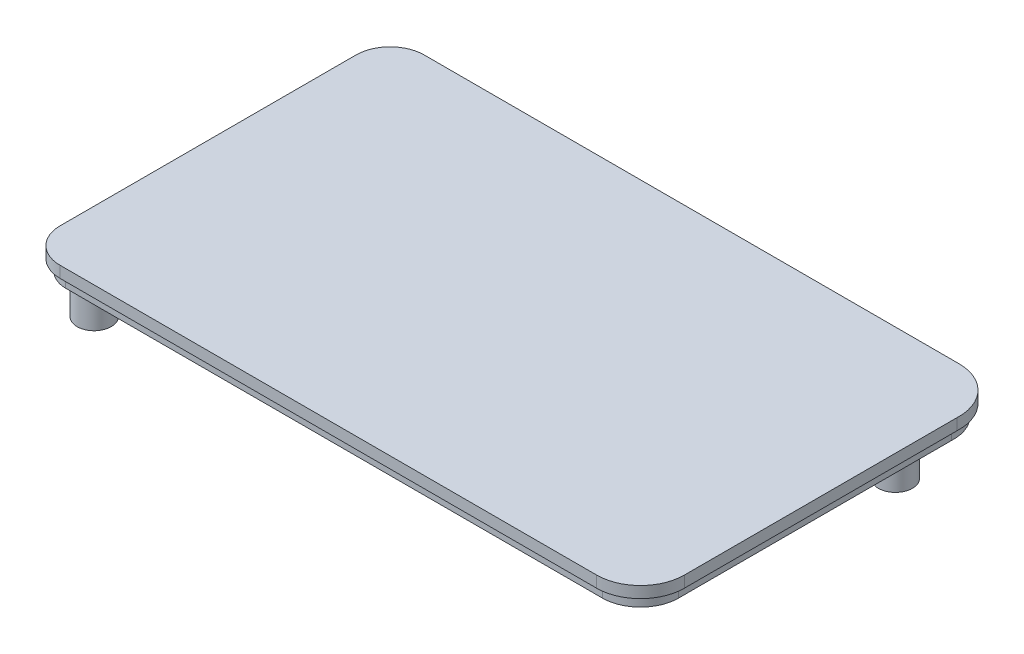
ISO-10303-21;
HEADER;
FILE_DESCRIPTION(('STEP AP214'),'2;1');
FILE_NAME('part.step','',(''),(''),'','','');
FILE_SCHEMA(('AUTOMOTIVE_DESIGN { 1 0 10303 214 1 1 1 1 }'));
ENDSEC;
DATA;
#1=APPLICATION_CONTEXT('core data for automotive mechanical design processes');
#2=APPLICATION_PROTOCOL_DEFINITION('international standard','automotive_design',2000,#1);
#3=PRODUCT_CONTEXT('',#1,'mechanical');
#4=PRODUCT('Part','Part','',(#3));
#5=PRODUCT_RELATED_PRODUCT_CATEGORY('part','',(#4));
#6=PRODUCT_DEFINITION_FORMATION('','',#4);
#7=PRODUCT_DEFINITION_CONTEXT('part definition',#1,'design');
#8=PRODUCT_DEFINITION('design','',#6,#7);
#9=PRODUCT_DEFINITION_SHAPE('','',#8);
#10=(LENGTH_UNIT() NAMED_UNIT(*) SI_UNIT(.MILLI.,.METRE.));
#11=(NAMED_UNIT(*) PLANE_ANGLE_UNIT() SI_UNIT($,.RADIAN.));
#12=(NAMED_UNIT(*) SI_UNIT($,.STERADIAN.) SOLID_ANGLE_UNIT());
#13=UNCERTAINTY_MEASURE_WITH_UNIT(LENGTH_MEASURE(1.E-05),#10,'distance_accuracy_value','');
#14=(GEOMETRIC_REPRESENTATION_CONTEXT(3) GLOBAL_UNCERTAINTY_ASSIGNED_CONTEXT((#13)) GLOBAL_UNIT_ASSIGNED_CONTEXT((#10,
#11,#12)) REPRESENTATION_CONTEXT('',''));
#15=CARTESIAN_POINT('',(0.,0.,0.));
#16=DIRECTION('',(0.,0.,1.));
#17=DIRECTION('',(1.,0.,0.));
#18=AXIS2_PLACEMENT_3D('',#15,#16,#17);
#19=CARTESIAN_POINT('',(73.2039928257921,2.,-27.8016177597412));
#20=DIRECTION('',(-0.999999998804765,0.,4.88924354639537E-05));
#21=DIRECTION('',(4.88924354639537E-05,0.,0.999999998804765));
#22=AXIS2_PLACEMENT_3D('',#19,#20,#21);
#23=PLANE('',#22);
#24=CARTESIAN_POINT('',(69.3542968956756,1.,-3.85086717604934));
#25=DIRECTION('',(0.,-1.,0.));
#26=DIRECTION('',(0.,0.,-1.));
#27=AXIS2_PLACEMENT_3D('',#24,#25,#26);
#28=CIRCLE('',#27,3.85086716973928);
#29=CARTESIAN_POINT('',(73.2051639113889,1.,-3.84977801728181));
#30=VERTEX_POINT('',#29);
#31=CARTESIAN_POINT('',(73.2051638872787,1.,-3.84969587016244));
#32=VERTEX_POINT('',#31);
#33=EDGE_CURVE('E236',#30,#32,#28,.T.);
#34=ORIENTED_EDGE('',*,*,#33,.F.);
#35=DIRECTION('',(-4.88924354639537E-05,0.,-0.999999998804765));
#36=VECTOR('',#35,1.);
#37=CARTESIAN_POINT('',(73.2039928257921,1.,-27.8016177597412));
#38=LINE('',#37,#36);
#39=CARTESIAN_POINT('',(73.2039928257921,1.,-27.8016177597412));
#40=VERTEX_POINT('',#39);
#41=EDGE_CURVE('E242',#30,#40,#38,.T.);
#42=ORIENTED_EDGE('',*,*,#41,.T.);
#43=DIRECTION('',(0.,-1.,0.));
#44=VECTOR('',#43,1.);
#45=CARTESIAN_POINT('',(73.2039928257921,2.,-27.8016177597412));
#46=LINE('',#45,#44);
#47=CARTESIAN_POINT('',(73.2039928257921,2.,-27.8016177597412));
#48=VERTEX_POINT('',#47);
#49=EDGE_CURVE('E268',#48,#40,#46,.T.);
#50=ORIENTED_EDGE('',*,*,#49,.F.);
#51=DIRECTION('',(-4.88924354639537E-05,0.,-0.999999998804765));
#52=VECTOR('',#51,1.);
#53=CARTESIAN_POINT('',(73.2039928257921,2.,-27.8016177597412));
#54=LINE('',#53,#52);
#55=CARTESIAN_POINT('',(73.2051638935887,2.,-3.84969587016052));
#56=VERTEX_POINT('',#55);
#57=EDGE_CURVE('E256',#56,#48,#54,.T.);
#58=ORIENTED_EDGE('',*,*,#57,.F.);
#59=DIRECTION('',(0.,-1.,0.));
#60=VECTOR('',#59,1.);
#61=CARTESIAN_POINT('',(73.2051638935887,2.,-3.84969587016052));
#62=LINE('',#61,#60);
#63=EDGE_CURVE('E271',#56,#32,#62,.T.);
#64=ORIENTED_EDGE('',*,*,#63,.T.);
#65=EDGE_LOOP('',(#34,#42,#50,#58,#64));
#66=FACE_BOUND('',#65,.T.);
#67=ADVANCED_FACE('F35',(#66),#23,.F.);
#68=CARTESIAN_POINT('',(22.2058950541222,2.,-28.9992690193114));
#69=DIRECTION('',(0.,-1.,0.));
#70=DIRECTION('',(0.,0.,-1.));
#71=AXIS2_PLACEMENT_3D('',#68,#69,#70);
#72=CYLINDRICAL_SURFACE('',#71,3.00073111427178);
#73=DIRECTION('',(0.,-1.,0.));
#74=VECTOR('',#73,1.);
#75=CARTESIAN_POINT('',(22.2058950541222,2.,-32.0000001335832));
#76=LINE('',#75,#74);
#77=CARTESIAN_POINT('',(22.2058950541222,2.,-32.0000001335832));
#78=VERTEX_POINT('',#77);
#79=CARTESIAN_POINT('',(22.2058950541222,1.,-32.0000001335832));
#80=VERTEX_POINT('',#79);
#81=EDGE_CURVE('E262',#78,#80,#76,.T.);
#82=ORIENTED_EDGE('',*,*,#81,.T.);
#83=CARTESIAN_POINT('',(22.2058950541222,1.,-28.9992690193114));
#84=DIRECTION('',(0.,-1.,0.));
#85=DIRECTION('',(0.,0.,-1.));
#86=AXIS2_PLACEMENT_3D('',#83,#84,#85);
#87=CIRCLE('',#86,3.00073111427178);
#88=CARTESIAN_POINT('',(19.2051639398505,1.,-28.9992690193114));
#89=VERTEX_POINT('',#88);
#90=EDGE_CURVE('E50',#89,#80,#87,.T.);
#91=ORIENTED_EDGE('',*,*,#90,.F.);
#92=DIRECTION('',(0.,-1.,0.));
#93=VECTOR('',#92,1.);
#94=CARTESIAN_POINT('',(19.2051639398505,2.,-28.9992690193114));
#95=LINE('',#94,#93);
#96=CARTESIAN_POINT('',(19.2051639398505,2.,-28.9992690193114));
#97=VERTEX_POINT('',#96);
#98=EDGE_CURVE('E283',#97,#89,#95,.T.);
#99=ORIENTED_EDGE('',*,*,#98,.F.);
#100=CARTESIAN_POINT('',(22.2058950541222,2.,-28.9992690193114));
#101=DIRECTION('',(0.,1.,0.));
#102=DIRECTION('',(0.,0.,-1.));
#103=AXIS2_PLACEMENT_3D('',#100,#101,#102);
#104=CIRCLE('',#103,3.00073111427178);
#105=EDGE_CURVE('E245',#78,#97,#104,.T.);
#106=ORIENTED_EDGE('',*,*,#105,.F.);
#107=EDGE_LOOP('',(#82,#91,#99,#106));
#108=FACE_BOUND('',#107,.T.);
#109=ADVANCED_FACE('F37',(#108),#72,.T.);
#110=CARTESIAN_POINT('',(19.2051639398505,2.,-3.0007304011226));
#111=DIRECTION('',(1.,0.,0.));
#112=DIRECTION('',(0.,0.,-1.));
#113=AXIS2_PLACEMENT_3D('',#110,#111,#112);
#114=PLANE('',#113);
#115=ORIENTED_EDGE('',*,*,#98,.T.);
#116=DIRECTION('',(0.,0.,-1.));
#117=VECTOR('',#116,1.);
#118=CARTESIAN_POINT('',(19.2051639398505,1.,-28.9992690193114));
#119=LINE('',#118,#117);
#120=CARTESIAN_POINT('',(19.2051639398505,1.,-3.0007304011226));
#121=VERTEX_POINT('',#120);
#122=EDGE_CURVE('E230',#121,#89,#119,.T.);
#123=ORIENTED_EDGE('',*,*,#122,.F.);
#124=DIRECTION('',(0.,-1.,0.));
#125=VECTOR('',#124,1.);
#126=CARTESIAN_POINT('',(19.2051639398505,2.,-3.0007304011226));
#127=LINE('',#126,#125);
#128=CARTESIAN_POINT('',(19.2051639398505,2.,-3.0007304011226));
#129=VERTEX_POINT('',#128);
#130=EDGE_CURVE('E280',#129,#121,#127,.T.);
#131=ORIENTED_EDGE('',*,*,#130,.F.);
#132=DIRECTION('',(0.,0.,1.));
#133=VECTOR('',#132,1.);
#134=CARTESIAN_POINT('',(19.2051639398505,2.,-3.0007304011226));
#135=LINE('',#134,#133);
#136=EDGE_CURVE('E248',#97,#129,#135,.T.);
#137=ORIENTED_EDGE('',*,*,#136,.F.);
#138=EDGE_LOOP('',(#115,#123,#131,#137));
#139=FACE_BOUND('',#138,.T.);
#140=ADVANCED_FACE('F322',(#139),#114,.F.);
#141=CARTESIAN_POINT('',(22.2058943409731,2.,-3.00073040112259));
#142=DIRECTION('',(0.,-1.,0.));
#143=DIRECTION('',(0.,0.,-1.));
#144=AXIS2_PLACEMENT_3D('',#141,#142,#143);
#145=CYLINDRICAL_SURFACE('',#144,3.00073040112259);
#146=ORIENTED_EDGE('',*,*,#130,.T.);
#147=CARTESIAN_POINT('',(22.2058943409731,1.,-3.0007304011226));
#148=DIRECTION('',(0.,-1.,0.));
#149=DIRECTION('',(0.,0.,1.));
#150=AXIS2_PLACEMENT_3D('',#147,#148,#149);
#151=CIRCLE('',#150,3.0007304011226);
#152=CARTESIAN_POINT('',(22.2058943409731,1.,0.));
#153=VERTEX_POINT('',#152);
#154=EDGE_CURVE('E217',#153,#121,#151,.T.);
#155=ORIENTED_EDGE('',*,*,#154,.F.);
#156=DIRECTION('',(0.,-1.,0.));
#157=VECTOR('',#156,1.);
#158=CARTESIAN_POINT('',(22.2058943409731,2.,0.));
#159=LINE('',#158,#157);
#160=CARTESIAN_POINT('',(22.2058943409731,2.,0.));
#161=VERTEX_POINT('',#160);
#162=EDGE_CURVE('E277',#161,#153,#159,.T.);
#163=ORIENTED_EDGE('',*,*,#162,.F.);
#164=CARTESIAN_POINT('',(22.2058943409731,2.,-3.00073040112259));
#165=DIRECTION('',(0.,1.,0.));
#166=DIRECTION('',(0.,0.,1.));
#167=AXIS2_PLACEMENT_3D('',#164,#165,#166);
#168=CIRCLE('',#167,3.00073040112259);
#169=EDGE_CURVE('E250',#129,#161,#168,.T.);
#170=ORIENTED_EDGE('',*,*,#169,.F.);
#171=EDGE_LOOP('',(#146,#155,#163,#170));
#172=FACE_BOUND('',#171,.T.);
#173=ADVANCED_FACE('F335',(#172),#145,.T.);
#174=CARTESIAN_POINT('',(69.3542968956755,2.,0.));
#175=DIRECTION('',(0.,0.,-1.));
#176=DIRECTION('',(-1.,0.,0.));
#177=AXIS2_PLACEMENT_3D('',#174,#175,#176);
#178=PLANE('',#177);
#179=ORIENTED_EDGE('',*,*,#162,.T.);
#180=DIRECTION('',(-1.,0.,0.));
#181=VECTOR('',#180,1.);
#182=CARTESIAN_POINT('',(22.2058943409731,1.,0.));
#183=LINE('',#182,#181);
#184=CARTESIAN_POINT('',(69.3542968956755,1.,0.));
#185=VERTEX_POINT('',#184);
#186=EDGE_CURVE('E238',#185,#153,#183,.T.);
#187=ORIENTED_EDGE('',*,*,#186,.F.);
#188=DIRECTION('',(0.,-1.,0.));
#189=VECTOR('',#188,1.);
#190=CARTESIAN_POINT('',(69.3542968956755,2.,0.));
#191=LINE('',#190,#189);
#192=CARTESIAN_POINT('',(69.3542968956755,2.,0.));
#193=VERTEX_POINT('',#192);
#194=EDGE_CURVE('E274',#193,#185,#191,.T.);
#195=ORIENTED_EDGE('',*,*,#194,.F.);
#196=DIRECTION('',(1.,0.,0.));
#197=VECTOR('',#196,1.);
#198=CARTESIAN_POINT('',(69.3542968956755,2.,0.));
#199=LINE('',#198,#197);
#200=EDGE_CURVE('E252',#161,#193,#199,.T.);
#201=ORIENTED_EDGE('',*,*,#200,.F.);
#202=EDGE_LOOP('',(#179,#187,#195,#201));
#203=FACE_BOUND('',#202,.T.);
#204=ADVANCED_FACE('F331',(#203),#178,.F.);
#205=CARTESIAN_POINT('',(69.3542968956755,2.,-3.85086717604935));
#206=DIRECTION('',(0.,-1.,0.));
#207=DIRECTION('',(0.,0.,-1.));
#208=AXIS2_PLACEMENT_3D('',#205,#206,#207);
#209=CYLINDRICAL_SURFACE('',#208,3.85086717604935);
#210=ORIENTED_EDGE('',*,*,#194,.T.);
#211=EDGE_CURVE('E235',#32,#185,#28,.T.);
#212=ORIENTED_EDGE('',*,*,#211,.F.);
#213=ORIENTED_EDGE('',*,*,#63,.F.);
#214=CARTESIAN_POINT('',(69.3542968956755,2.,-3.85086717604935));
#215=DIRECTION('',(0.,1.,0.));
#216=DIRECTION('',(0.,0.,1.));
#217=AXIS2_PLACEMENT_3D('',#214,#215,#216);
#218=CIRCLE('',#217,3.85086717604935);
#219=EDGE_CURVE('E254',#193,#56,#218,.T.);
#220=ORIENTED_EDGE('',*,*,#219,.F.);
#221=EDGE_LOOP('',(#210,#212,#213,#220));
#222=FACE_BOUND('',#221,.T.);
#223=ADVANCED_FACE('F328',(#222),#209,.T.);
#224=CARTESIAN_POINT('',(69.2040540247361,2.,-27.9953713049653));
#225=DIRECTION('',(0.,-1.,0.));
#226=DIRECTION('',(0.,0.,-1.));
#227=AXIS2_PLACEMENT_3D('',#224,#225,#226);
#228=CYLINDRICAL_SURFACE('',#227,4.00462867797753);
#229=ORIENTED_EDGE('',*,*,#49,.T.);
#230=CARTESIAN_POINT('',(69.2040540247361,1.,-27.9953713049653));
#231=DIRECTION('',(0.,1.,0.));
#232=DIRECTION('',(0.,0.,1.));
#233=AXIS2_PLACEMENT_3D('',#230,#231,#232);
#234=CIRCLE('',#233,4.00462867797753);
#235=CARTESIAN_POINT('',(69.2040540247361,1.,-31.9999999829428));
#236=VERTEX_POINT('',#235);
#237=EDGE_CURVE('E240',#40,#236,#234,.T.);
#238=ORIENTED_EDGE('',*,*,#237,.T.);
#239=DIRECTION('',(0.,-1.,0.));
#240=VECTOR('',#239,1.);
#241=CARTESIAN_POINT('',(69.2040540247361,2.,-31.9999999829428));
#242=LINE('',#241,#240);
#243=CARTESIAN_POINT('',(69.2040540247361,2.,-31.9999999829428));
#244=VERTEX_POINT('',#243);
#245=EDGE_CURVE('E265',#244,#236,#242,.T.);
#246=ORIENTED_EDGE('',*,*,#245,.F.);
#247=CARTESIAN_POINT('',(69.2040540247361,2.,-27.9953713049653));
#248=DIRECTION('',(0.,1.,0.));
#249=DIRECTION('',(0.,0.,1.));
#250=AXIS2_PLACEMENT_3D('',#247,#248,#249);
#251=CIRCLE('',#250,4.00462867797753);
#252=EDGE_CURVE('E258',#48,#244,#251,.T.);
#253=ORIENTED_EDGE('',*,*,#252,.F.);
#254=EDGE_LOOP('',(#229,#238,#246,#253));
#255=FACE_BOUND('',#254,.T.);
#256=ADVANCED_FACE('F327',(#255),#228,.T.);
#257=CARTESIAN_POINT('',(22.2058950541222,2.,-32.0000001335832));
#258=DIRECTION('',(-3.20524050790238E-09,0.,1.));
#259=DIRECTION('',(1.,0.,3.20524050790238E-09));
#260=AXIS2_PLACEMENT_3D('',#257,#258,#259);
#261=PLANE('',#260);
#262=ORIENTED_EDGE('',*,*,#245,.T.);
#263=DIRECTION('',(1.,0.,3.20524050790238E-09));
#264=VECTOR('',#263,1.);
#265=CARTESIAN_POINT('',(69.2040540247361,1.,-31.9999999829428));
#266=LINE('',#265,#264);
#267=EDGE_CURVE('E233',#80,#236,#266,.T.);
#268=ORIENTED_EDGE('',*,*,#267,.F.);
#269=ORIENTED_EDGE('',*,*,#81,.F.);
#270=DIRECTION('',(-1.,0.,-3.20524050790238E-09));
#271=VECTOR('',#270,1.);
#272=CARTESIAN_POINT('',(22.2058950541222,2.,-32.0000001335832));
#273=LINE('',#272,#271);
#274=EDGE_CURVE('E260',#244,#78,#273,.T.);
#275=ORIENTED_EDGE('',*,*,#274,.F.);
#276=EDGE_LOOP('',(#262,#268,#269,#275));
#277=FACE_BOUND('',#276,.T.);
#278=ADVANCED_FACE('F350',(#277),#261,.F.);
#279=CARTESIAN_POINT('',(22.2058950541222,2.,-28.9992690193114));
#280=DIRECTION('',(0.,-1.,0.));
#281=DIRECTION('',(0.,0.,-1.));
#282=AXIS2_PLACEMENT_3D('',#279,#280,#281);
#283=PLANE('',#282);
#284=ORIENTED_EDGE('',*,*,#105,.T.);
#285=ORIENTED_EDGE('',*,*,#136,.T.);
#286=ORIENTED_EDGE('',*,*,#169,.T.);
#287=ORIENTED_EDGE('',*,*,#200,.T.);
#288=ORIENTED_EDGE('',*,*,#219,.T.);
#289=ORIENTED_EDGE('',*,*,#57,.T.);
#290=ORIENTED_EDGE('',*,*,#252,.T.);
#291=ORIENTED_EDGE('',*,*,#274,.T.);
#292=EDGE_LOOP('',(#284,#285,#286,#287,#288,#289,#290,#291));
#293=FACE_BOUND('',#292,.T.);
#294=ADVANCED_FACE('F357',(#293),#283,.F.);
#295=CARTESIAN_POINT('',(22.2058943409731,1.,-3.0007304011226));
#296=DIRECTION('',(0.,1.,0.));
#297=DIRECTION('',(0.,0.,1.));
#298=AXIS2_PLACEMENT_3D('',#295,#296,#297);
#299=PLANE('',#298);
#300=CARTESIAN_POINT('',(22.2058943409731,1.,-3.0007304011226));
#301=DIRECTION('',(0.,-1.,0.));
#302=DIRECTION('',(0.,0.,1.));
#303=AXIS2_PLACEMENT_3D('',#300,#301,#302);
#304=CIRCLE('',#303,2.5007304011226);
#305=CARTESIAN_POINT('',(22.2058943409731,1.,-0.5));
#306=VERTEX_POINT('',#305);
#307=CARTESIAN_POINT('',(19.7051639398505,1.,-3.0007304011226));
#308=VERTEX_POINT('',#307);
#309=EDGE_CURVE('E170',#306,#308,#304,.T.);
#310=ORIENTED_EDGE('',*,*,#309,.F.);
#311=DIRECTION('',(-1.,0.,0.));
#312=VECTOR('',#311,1.);
#313=CARTESIAN_POINT('',(22.2058943409731,1.,-0.5));
#314=LINE('',#313,#312);
#315=CARTESIAN_POINT('',(69.3542968956755,1.,-0.500000000000004));
#316=VERTEX_POINT('',#315);
#317=EDGE_CURVE('E164',#316,#306,#314,.T.);
#318=ORIENTED_EDGE('',*,*,#317,.F.);
#319=CARTESIAN_POINT('',(69.3542968956756,1.,-3.85086717604934));
#320=DIRECTION('',(0.,-1.,0.));
#321=DIRECTION('',(0.,0.,-1.));
#322=AXIS2_PLACEMENT_3D('',#319,#320,#321);
#323=CIRCLE('',#322,3.35086717604933);
#324=CARTESIAN_POINT('',(72.7051639167181,1.,-3.84984795355308));
#325=VERTEX_POINT('',#324);
#326=EDGE_CURVE('E197',#325,#316,#323,.T.);
#327=ORIENTED_EDGE('',*,*,#326,.F.);
#328=DIRECTION('',(2.4421707192363E-05,0.,0.99999999970179));
#329=VECTOR('',#328,1.);
#330=CARTESIAN_POINT('',(72.7051639167181,1.,-3.84984795355308));
#331=LINE('',#330,#329);
#332=CARTESIAN_POINT('',(72.7045783828186,1.,-27.8258089595757));
#333=VERTEX_POINT('',#332);
#334=EDGE_CURVE('E194',#333,#325,#331,.T.);
#335=ORIENTED_EDGE('',*,*,#334,.F.);
#336=CARTESIAN_POINT('',(69.2040540247361,1.,-27.9953713049652));
#337=DIRECTION('',(0.,-1.,0.));
#338=DIRECTION('',(0.,0.,-1.));
#339=AXIS2_PLACEMENT_3D('',#336,#337,#338);
#340=CIRCLE('',#339,3.50462867797756);
#341=CARTESIAN_POINT('',(69.2040540247361,1.,-31.4999999829428));
#342=VERTEX_POINT('',#341);
#343=EDGE_CURVE('E191',#342,#333,#340,.T.);
#344=ORIENTED_EDGE('',*,*,#343,.F.);
#345=DIRECTION('',(1.,0.,3.20524050790238E-09));
#346=VECTOR('',#345,1.);
#347=CARTESIAN_POINT('',(69.2040540247361,1.,-31.4999999829428));
#348=LINE('',#347,#346);
#349=CARTESIAN_POINT('',(22.2058950541222,1.,-31.5000001335832));
#350=VERTEX_POINT('',#349);
#351=EDGE_CURVE('E188',#350,#342,#348,.T.);
#352=ORIENTED_EDGE('',*,*,#351,.F.);
#353=CARTESIAN_POINT('',(22.2058950541222,1.,-28.9992690193114));
#354=DIRECTION('',(0.,-1.,0.));
#355=DIRECTION('',(0.,0.,-1.));
#356=AXIS2_PLACEMENT_3D('',#353,#354,#355);
#357=CIRCLE('',#356,2.50073111427178);
#358=CARTESIAN_POINT('',(19.7051639398505,1.,-28.9992690193114));
#359=VERTEX_POINT('',#358);
#360=EDGE_CURVE('E174',#359,#350,#357,.T.);
#361=ORIENTED_EDGE('',*,*,#360,.F.);
#362=DIRECTION('',(0.,0.,-1.));
#363=VECTOR('',#362,1.);
#364=CARTESIAN_POINT('',(19.7051639398505,1.,-28.9992690193114));
#365=LINE('',#364,#363);
#366=EDGE_CURVE('E156',#308,#359,#365,.T.);
#367=ORIENTED_EDGE('',*,*,#366,.F.);
#368=EDGE_LOOP('',(#310,#318,#327,#335,#344,#352,#361,#367));
#369=FACE_BOUND('',#368,.T.);
#370=ORIENTED_EDGE('',*,*,#33,.T.);
#371=ORIENTED_EDGE('',*,*,#211,.T.);
#372=ORIENTED_EDGE('',*,*,#186,.T.);
#373=ORIENTED_EDGE('',*,*,#154,.T.);
#374=ORIENTED_EDGE('',*,*,#122,.T.);
#375=ORIENTED_EDGE('',*,*,#90,.T.);
#376=ORIENTED_EDGE('',*,*,#267,.T.);
#377=ORIENTED_EDGE('',*,*,#237,.F.);
#378=ORIENTED_EDGE('',*,*,#41,.F.);
#379=EDGE_LOOP('',(#370,#371,#372,#373,#374,#375,#376,#377,#378));
#380=FACE_BOUND('',#379,.T.);
#381=ADVANCED_FACE('F168',(#369,#380),#299,.F.);
#382=CARTESIAN_POINT('',(22.2058943409731,1.,-3.0007304011226));
#383=DIRECTION('',(0.,-1.,0.));
#384=DIRECTION('',(0.,0.,-1.));
#385=AXIS2_PLACEMENT_3D('',#382,#383,#384);
#386=CYLINDRICAL_SURFACE('',#385,2.5007304011226);
#387=CARTESIAN_POINT('',(22.2058943409731,0.,-3.0007304011226));
#388=DIRECTION('',(0.,-1.,0.));
#389=DIRECTION('',(0.,0.,1.));
#390=AXIS2_PLACEMENT_3D('',#387,#388,#389);
#391=CIRCLE('',#390,2.5007304011226);
#392=CARTESIAN_POINT('',(22.2058943409731,0.,-0.5));
#393=VERTEX_POINT('',#392);
#394=CARTESIAN_POINT('',(19.7051639398505,0.,-3.0007304011226));
#395=VERTEX_POINT('',#394);
#396=EDGE_CURVE('E201',#393,#395,#391,.T.);
#397=ORIENTED_EDGE('',*,*,#396,.F.);
#398=DIRECTION('',(0.,-1.,0.));
#399=VECTOR('',#398,1.);
#400=CARTESIAN_POINT('',(22.2058943409731,1.,-0.5));
#401=LINE('',#400,#399);
#402=EDGE_CURVE('E177',#306,#393,#401,.T.);
#403=ORIENTED_EDGE('',*,*,#402,.F.);
#404=ORIENTED_EDGE('',*,*,#309,.T.);
#405=DIRECTION('',(0.,-1.,0.));
#406=VECTOR('',#405,1.);
#407=CARTESIAN_POINT('',(19.7051639398505,1.,-3.0007304011226));
#408=LINE('',#407,#406);
#409=EDGE_CURVE('E153',#308,#395,#408,.T.);
#410=ORIENTED_EDGE('',*,*,#409,.T.);
#411=EDGE_LOOP('',(#397,#403,#404,#410));
#412=FACE_BOUND('',#411,.T.);
#413=ADVANCED_FACE('F176',(#412),#386,.T.);
#414=CARTESIAN_POINT('',(22.2058943409731,1.,-0.5));
#415=DIRECTION('',(0.,0.,1.));
#416=DIRECTION('',(1.,0.,0.));
#417=AXIS2_PLACEMENT_3D('',#414,#415,#416);
#418=PLANE('',#417);
#419=DIRECTION('',(-1.,0.,0.));
#420=VECTOR('',#419,1.);
#421=CARTESIAN_POINT('',(22.2058943409731,0.,-0.5));
#422=LINE('',#421,#420);
#423=CARTESIAN_POINT('',(69.3542968956755,0.,-0.500000000000004));
#424=VERTEX_POINT('',#423);
#425=EDGE_CURVE('E178',#424,#393,#422,.T.);
#426=ORIENTED_EDGE('',*,*,#425,.F.);
#427=DIRECTION('',(0.,-1.,0.));
#428=VECTOR('',#427,1.);
#429=CARTESIAN_POINT('',(69.3542968956755,1.,-0.500000000000004));
#430=LINE('',#429,#428);
#431=EDGE_CURVE('E218',#316,#424,#430,.T.);
#432=ORIENTED_EDGE('',*,*,#431,.F.);
#433=ORIENTED_EDGE('',*,*,#317,.T.);
#434=ORIENTED_EDGE('',*,*,#402,.T.);
#435=EDGE_LOOP('',(#426,#432,#433,#434));
#436=FACE_BOUND('',#435,.T.);
#437=ADVANCED_FACE('F376',(#436),#418,.T.);
#438=CARTESIAN_POINT('',(69.3542968956756,1.,-3.85086717604934));
#439=DIRECTION('',(0.,-1.,0.));
#440=DIRECTION('',(0.,0.,-1.));
#441=AXIS2_PLACEMENT_3D('',#438,#439,#440);
#442=CYLINDRICAL_SURFACE('',#441,3.35086717604933);
#443=CARTESIAN_POINT('',(69.3542968956756,0.,-3.85086717604934));
#444=DIRECTION('',(0.,-1.,0.));
#445=DIRECTION('',(0.,0.,-1.));
#446=AXIS2_PLACEMENT_3D('',#443,#444,#445);
#447=CIRCLE('',#446,3.35086717604933);
#448=CARTESIAN_POINT('',(72.7051639167181,0.,-3.84984795355308));
#449=VERTEX_POINT('',#448);
#450=EDGE_CURVE('E181',#449,#424,#447,.T.);
#451=ORIENTED_EDGE('',*,*,#450,.F.);
#452=DIRECTION('',(0.,-1.,0.));
#453=VECTOR('',#452,1.);
#454=CARTESIAN_POINT('',(72.7051639167181,1.,-3.84984795355308));
#455=LINE('',#454,#453);
#456=EDGE_CURVE('E220',#325,#449,#455,.T.);
#457=ORIENTED_EDGE('',*,*,#456,.F.);
#458=ORIENTED_EDGE('',*,*,#326,.T.);
#459=ORIENTED_EDGE('',*,*,#431,.T.);
#460=EDGE_LOOP('',(#451,#457,#458,#459));
#461=FACE_BOUND('',#460,.T.);
#462=ADVANCED_FACE('F393',(#461),#442,.T.);
#463=CARTESIAN_POINT('',(72.7051639167181,1.,-3.84984795355308));
#464=DIRECTION('',(0.99999999970179,0.,-2.4421707192363E-05));
#465=DIRECTION('',(-2.4421707192363E-05,0.,-0.99999999970179));
#466=AXIS2_PLACEMENT_3D('',#463,#464,#465);
#467=PLANE('',#466);
#468=DIRECTION('',(2.4421707192363E-05,0.,0.99999999970179));
#469=VECTOR('',#468,1.);
#470=CARTESIAN_POINT('',(72.7051639167181,0.,-3.84984795355308));
#471=LINE('',#470,#469);
#472=CARTESIAN_POINT('',(72.7045783828186,0.,-27.8258089595757));
#473=VERTEX_POINT('',#472);
#474=EDGE_CURVE('E211',#473,#449,#471,.T.);
#475=ORIENTED_EDGE('',*,*,#474,.F.);
#476=DIRECTION('',(0.,-1.,0.));
#477=VECTOR('',#476,1.);
#478=CARTESIAN_POINT('',(72.7045783828186,1.,-27.8258089595757));
#479=LINE('',#478,#477);
#480=EDGE_CURVE('E222',#333,#473,#479,.T.);
#481=ORIENTED_EDGE('',*,*,#480,.F.);
#482=ORIENTED_EDGE('',*,*,#334,.T.);
#483=ORIENTED_EDGE('',*,*,#456,.T.);
#484=EDGE_LOOP('',(#475,#481,#482,#483));
#485=FACE_BOUND('',#484,.T.);
#486=ADVANCED_FACE('F389',(#485),#467,.T.);
#487=CARTESIAN_POINT('',(69.2040540247361,1.,-27.9953713049652));
#488=DIRECTION('',(0.,-1.,0.));
#489=DIRECTION('',(0.,0.,-1.));
#490=AXIS2_PLACEMENT_3D('',#487,#488,#489);
#491=CYLINDRICAL_SURFACE('',#490,3.50462867797756);
#492=CARTESIAN_POINT('',(69.2040540247361,0.,-27.9953713049652));
#493=DIRECTION('',(0.,-1.,0.));
#494=DIRECTION('',(0.,0.,-1.));
#495=AXIS2_PLACEMENT_3D('',#492,#493,#494);
#496=CIRCLE('',#495,3.50462867797756);
#497=CARTESIAN_POINT('',(69.2040540247361,0.,-31.4999999829428));
#498=VERTEX_POINT('',#497);
#499=EDGE_CURVE('E208',#498,#473,#496,.T.);
#500=ORIENTED_EDGE('',*,*,#499,.F.);
#501=DIRECTION('',(0.,-1.,0.));
#502=VECTOR('',#501,1.);
#503=CARTESIAN_POINT('',(69.2040540247361,1.,-31.4999999829428));
#504=LINE('',#503,#502);
#505=EDGE_CURVE('E224',#342,#498,#504,.T.);
#506=ORIENTED_EDGE('',*,*,#505,.F.);
#507=ORIENTED_EDGE('',*,*,#343,.T.);
#508=ORIENTED_EDGE('',*,*,#480,.T.);
#509=EDGE_LOOP('',(#500,#506,#507,#508));
#510=FACE_BOUND('',#509,.T.);
#511=ADVANCED_FACE('F385',(#510),#491,.T.);
#512=CARTESIAN_POINT('',(69.2040540247361,1.,-31.4999999829428));
#513=DIRECTION('',(3.20524050790238E-09,0.,-1.));
#514=DIRECTION('',(-1.,0.,-3.20524050790238E-09));
#515=AXIS2_PLACEMENT_3D('',#512,#513,#514);
#516=PLANE('',#515);
#517=DIRECTION('',(1.,0.,3.20524050790238E-09));
#518=VECTOR('',#517,1.);
#519=CARTESIAN_POINT('',(69.2040540247361,0.,-31.4999999829428));
#520=LINE('',#519,#518);
#521=CARTESIAN_POINT('',(22.2058950541222,0.,-31.5000001335832));
#522=VERTEX_POINT('',#521);
#523=EDGE_CURVE('E205',#522,#498,#520,.T.);
#524=ORIENTED_EDGE('',*,*,#523,.F.);
#525=DIRECTION('',(0.,-1.,0.));
#526=VECTOR('',#525,1.);
#527=CARTESIAN_POINT('',(22.2058950541222,1.,-31.5000001335832));
#528=LINE('',#527,#526);
#529=EDGE_CURVE('E226',#350,#522,#528,.T.);
#530=ORIENTED_EDGE('',*,*,#529,.F.);
#531=ORIENTED_EDGE('',*,*,#351,.T.);
#532=ORIENTED_EDGE('',*,*,#505,.T.);
#533=EDGE_LOOP('',(#524,#530,#531,#532));
#534=FACE_BOUND('',#533,.T.);
#535=ADVANCED_FACE('F382',(#534),#516,.T.);
#536=CARTESIAN_POINT('',(22.2058950541222,1.,-28.9992690193114));
#537=DIRECTION('',(0.,-1.,0.));
#538=DIRECTION('',(0.,0.,-1.));
#539=AXIS2_PLACEMENT_3D('',#536,#537,#538);
#540=CYLINDRICAL_SURFACE('',#539,2.50073111427178);
#541=CARTESIAN_POINT('',(22.2058950541222,0.,-28.9992690193114));
#542=DIRECTION('',(0.,-1.,0.));
#543=DIRECTION('',(0.,0.,-1.));
#544=AXIS2_PLACEMENT_3D('',#541,#542,#543);
#545=CIRCLE('',#544,2.50073111427178);
#546=CARTESIAN_POINT('',(19.7051639398505,0.,-28.9992690193114));
#547=VERTEX_POINT('',#546);
#548=EDGE_CURVE('E58',#547,#522,#545,.T.);
#549=ORIENTED_EDGE('',*,*,#548,.F.);
#550=DIRECTION('',(0.,-1.,0.));
#551=VECTOR('',#550,1.);
#552=CARTESIAN_POINT('',(19.7051639398505,1.,-28.9992690193114));
#553=LINE('',#552,#551);
#554=EDGE_CURVE('E163',#359,#547,#553,.T.);
#555=ORIENTED_EDGE('',*,*,#554,.F.);
#556=ORIENTED_EDGE('',*,*,#360,.T.);
#557=ORIENTED_EDGE('',*,*,#529,.T.);
#558=EDGE_LOOP('',(#549,#555,#556,#557));
#559=FACE_BOUND('',#558,.T.);
#560=ADVANCED_FACE('F379',(#559),#540,.T.);
#561=CARTESIAN_POINT('',(19.7051639398505,1.,-28.9992690193114));
#562=DIRECTION('',(-1.,0.,0.));
#563=DIRECTION('',(0.,0.,1.));
#564=AXIS2_PLACEMENT_3D('',#561,#562,#563);
#565=PLANE('',#564);
#566=DIRECTION('',(0.,0.,-1.));
#567=VECTOR('',#566,1.);
#568=CARTESIAN_POINT('',(19.7051639398505,0.,-28.9992690193114));
#569=LINE('',#568,#567);
#570=EDGE_CURVE('E158',#395,#547,#569,.T.);
#571=ORIENTED_EDGE('',*,*,#570,.F.);
#572=ORIENTED_EDGE('',*,*,#409,.F.);
#573=ORIENTED_EDGE('',*,*,#366,.T.);
#574=ORIENTED_EDGE('',*,*,#554,.T.);
#575=EDGE_LOOP('',(#571,#572,#573,#574));
#576=FACE_BOUND('',#575,.T.);
#577=ADVANCED_FACE('F155',(#576),#565,.T.);
#578=CARTESIAN_POINT('',(22.2058950541222,0.,-28.9992690193114));
#579=DIRECTION('',(0.,-1.,0.));
#580=DIRECTION('',(0.,0.,-1.));
#581=AXIS2_PLACEMENT_3D('',#578,#579,#580);
#582=PLANE('',#581);
#583=CARTESIAN_POINT('',(69.7051639398505,0.,-25.900001));
#584=DIRECTION('',(0.,-1.,0.));
#585=DIRECTION('',(0.,0.,-1.));
#586=AXIS2_PLACEMENT_3D('',#583,#584,#585);
#587=CIRCLE('',#586,1.50000000000001);
#588=CARTESIAN_POINT('',(69.7051639398505,0.,-27.4000010000001));
#589=VERTEX_POINT('',#588);
#590=EDGE_CURVE('E419',#589,#589,#587,.T.);
#591=ORIENTED_EDGE('',*,*,#590,.F.);
#592=EDGE_LOOP('',(#591));
#593=FACE_BOUND('',#592,.T.);
#594=CARTESIAN_POINT('',(22.2058943409731,0.,-3.0007304011226));
#595=DIRECTION('',(0.,-1.,0.));
#596=DIRECTION('',(0.,0.,-1.));
#597=AXIS2_PLACEMENT_3D('',#594,#595,#596);
#598=CIRCLE('',#597,1.50103145825016);
#599=CARTESIAN_POINT('',(22.2058943409731,0.,-4.50176185937276));
#600=VERTEX_POINT('',#599);
#601=EDGE_CURVE('E422',#600,#600,#598,.T.);
#602=ORIENTED_EDGE('',*,*,#601,.F.);
#603=EDGE_LOOP('',(#602));
#604=FACE_BOUND('',#603,.T.);
#605=ORIENTED_EDGE('',*,*,#425,.T.);
#606=ORIENTED_EDGE('',*,*,#396,.T.);
#607=ORIENTED_EDGE('',*,*,#570,.T.);
#608=ORIENTED_EDGE('',*,*,#548,.T.);
#609=ORIENTED_EDGE('',*,*,#523,.T.);
#610=ORIENTED_EDGE('',*,*,#499,.T.);
#611=ORIENTED_EDGE('',*,*,#474,.T.);
#612=ORIENTED_EDGE('',*,*,#450,.T.);
#613=EDGE_LOOP('',(#605,#606,#607,#608,#609,#610,#611,#612));
#614=FACE_BOUND('',#613,.T.);
#615=ADVANCED_FACE('F295',(#593,#604,#614),#582,.T.);
#616=CARTESIAN_POINT('',(22.2058943409731,-7.67095755340676,-3.0007304011226));
#617=DIRECTION('',(0.,1.,0.));
#618=DIRECTION('',(0.,0.,1.));
#619=AXIS2_PLACEMENT_3D('',#616,#617,#618);
#620=CYLINDRICAL_SURFACE('',#619,1.50103145825016);
#621=CARTESIAN_POINT('',(22.2058943409731,-3.42539946179468,-3.0007304011226));
#622=DIRECTION('',(0.,1.,0.));
#623=DIRECTION('',(0.,0.,1.));
#624=AXIS2_PLACEMENT_3D('',#621,#622,#623);
#625=CIRCLE('',#624,1.50103145825016);
#626=CARTESIAN_POINT('',(22.2058943409731,-3.42539946179468,-1.49969894287244));
#627=VERTEX_POINT('',#626);
#628=EDGE_CURVE('E418',#627,#627,#625,.T.);
#629=ORIENTED_EDGE('',*,*,#628,.T.);
#630=EDGE_LOOP('',(#629));
#631=FACE_BOUND('',#630,.T.);
#632=ORIENTED_EDGE('',*,*,#601,.T.);
#633=EDGE_LOOP('',(#632));
#634=FACE_BOUND('',#633,.T.);
#635=ADVANCED_FACE('F310',(#631,#634),#620,.T.);
#636=CARTESIAN_POINT('',(22.2058943409731,-7.67095755340676,-3.0007304011226));
#637=DIRECTION('',(0.,1.,0.));
#638=DIRECTION('',(0.,0.,1.));
#639=AXIS2_PLACEMENT_3D('',#636,#637,#638);
#640=CYLINDRICAL_SURFACE('',#639,1.00103199825016);
#641=CARTESIAN_POINT('',(22.2058943409731,-3.42539946179468,-3.0007304011226));
#642=DIRECTION('',(0.,1.,0.));
#643=DIRECTION('',(0.,0.,1.));
#644=AXIS2_PLACEMENT_3D('',#641,#642,#643);
#645=CIRCLE('',#644,1.00103199825016);
#646=CARTESIAN_POINT('',(22.2058943409731,-3.42539946179468,-1.99969840287244));
#647=VERTEX_POINT('',#646);
#648=EDGE_CURVE('E184',#647,#647,#645,.T.);
#649=ORIENTED_EDGE('',*,*,#648,.F.);
#650=EDGE_LOOP('',(#649));
#651=FACE_BOUND('',#650,.T.);
#652=CARTESIAN_POINT('',(22.2058943409731,0.,-3.0007304011226));
#653=DIRECTION('',(0.,-1.,0.));
#654=DIRECTION('',(0.,0.,-1.));
#655=AXIS2_PLACEMENT_3D('',#652,#653,#654);
#656=CIRCLE('',#655,1.00103199825016);
#657=CARTESIAN_POINT('',(22.2058943409731,0.,-4.00176239937275));
#658=VERTEX_POINT('',#657);
#659=EDGE_CURVE('E43',#658,#658,#656,.F.);
#660=ORIENTED_EDGE('',*,*,#659,.T.);
#661=EDGE_LOOP('',(#660));
#662=FACE_BOUND('',#661,.T.);
#663=ADVANCED_FACE('F288',(#651,#662),#640,.F.);
#664=CARTESIAN_POINT('',(7.20516393985046,-3.42539946179468,-10.));
#665=DIRECTION('',(0.,1.,0.));
#666=DIRECTION('',(1.,0.,0.));
#667=AXIS2_PLACEMENT_3D('',#664,#665,#666);
#668=PLANE('',#667);
#669=ORIENTED_EDGE('',*,*,#648,.T.);
#670=EDGE_LOOP('',(#669));
#671=FACE_BOUND('',#670,.T.);
#672=ORIENTED_EDGE('',*,*,#628,.F.);
#673=EDGE_LOOP('',(#672));
#674=FACE_BOUND('',#673,.T.);
#675=ADVANCED_FACE('F293',(#671,#674),#668,.F.);
#676=ORIENTED_EDGE('',*,*,#659,.F.);
#677=EDGE_LOOP('',(#676));
#678=FACE_BOUND('',#677,.T.);
#679=ADVANCED_FACE('F290',(#678),#582,.T.);
#680=CARTESIAN_POINT('',(69.7051639398505,-7.67095755340676,-25.900001));
#681=DIRECTION('',(0.,1.,0.));
#682=DIRECTION('',(0.,0.,1.));
#683=AXIS2_PLACEMENT_3D('',#680,#681,#682);
#684=CYLINDRICAL_SURFACE('',#683,1.50000000000001);
#685=CARTESIAN_POINT('',(69.7051639398505,-3.42539946179468,-25.900001));
#686=DIRECTION('',(0.,1.,0.));
#687=DIRECTION('',(0.,0.,1.));
#688=AXIS2_PLACEMENT_3D('',#685,#686,#687);
#689=CIRCLE('',#688,1.50000000000001);
#690=CARTESIAN_POINT('',(69.7051639398505,-3.42539946179468,-24.400001));
#691=VERTEX_POINT('',#690);
#692=EDGE_CURVE('E424',#691,#691,#689,.T.);
#693=ORIENTED_EDGE('',*,*,#692,.T.);
#694=EDGE_LOOP('',(#693));
#695=FACE_BOUND('',#694,.T.);
#696=ORIENTED_EDGE('',*,*,#590,.T.);
#697=EDGE_LOOP('',(#696));
#698=FACE_BOUND('',#697,.T.);
#699=ADVANCED_FACE('F292',(#695,#698),#684,.T.);
#700=CARTESIAN_POINT('',(69.7051639398505,-7.67095755340676,-25.900001));
#701=DIRECTION('',(0.,1.,0.));
#702=DIRECTION('',(0.,0.,1.));
#703=AXIS2_PLACEMENT_3D('',#700,#701,#702);
#704=CYLINDRICAL_SURFACE('',#703,1.00000054);
#705=CARTESIAN_POINT('',(69.7051639398505,-3.42539946179468,-25.900001));
#706=DIRECTION('',(0.,1.,0.));
#707=DIRECTION('',(1.,0.,0.));
#708=AXIS2_PLACEMENT_3D('',#705,#706,#707);
#709=CIRCLE('',#708,1.00000054);
#710=CARTESIAN_POINT('',(70.7051644798505,-3.42539946179468,-25.900001));
#711=VERTEX_POINT('',#710);
#712=EDGE_CURVE('E416',#711,#711,#709,.T.);
#713=ORIENTED_EDGE('',*,*,#712,.F.);
#714=EDGE_LOOP('',(#713));
#715=FACE_BOUND('',#714,.T.);
#716=CARTESIAN_POINT('',(69.7051639398505,0.,-25.900001));
#717=DIRECTION('',(0.,-1.,0.));
#718=DIRECTION('',(0.,0.,-1.));
#719=AXIS2_PLACEMENT_3D('',#716,#717,#718);
#720=CIRCLE('',#719,1.00000054);
#721=CARTESIAN_POINT('',(69.7051639398505,0.,-26.90000154));
#722=VERTEX_POINT('',#721);
#723=EDGE_CURVE('E11',#722,#722,#720,.F.);
#724=ORIENTED_EDGE('',*,*,#723,.T.);
#725=EDGE_LOOP('',(#724));
#726=FACE_BOUND('',#725,.T.);
#727=ADVANCED_FACE('F301',(#715,#726),#704,.F.);
#728=CARTESIAN_POINT('',(7.20516393985046,-3.42539946179468,-10.));
#729=DIRECTION('',(0.,1.,0.));
#730=DIRECTION('',(1.,0.,0.));
#731=AXIS2_PLACEMENT_3D('',#728,#729,#730);
#732=PLANE('',#731);
#733=ORIENTED_EDGE('',*,*,#712,.T.);
#734=EDGE_LOOP('',(#733));
#735=FACE_BOUND('',#734,.T.);
#736=ORIENTED_EDGE('',*,*,#692,.F.);
#737=EDGE_LOOP('',(#736));
#738=FACE_BOUND('',#737,.T.);
#739=ADVANCED_FACE('F313',(#735,#738),#732,.F.);
#740=ORIENTED_EDGE('',*,*,#723,.F.);
#741=EDGE_LOOP('',(#740));
#742=FACE_BOUND('',#741,.T.);
#743=ADVANCED_FACE('F296',(#742),#582,.T.);
#744=CLOSED_SHELL('',(#67,#109,#140,#173,#204,#223,#256,#278,#294,#381,#413,#437,#462,#486,#511,
#535,#560,#577,#615,#635,#663,#675,#679,#699,#727,#739,#743));
#745=MANIFOLD_SOLID_BREP('B2',#744);
#746=ADVANCED_BREP_SHAPE_REPRESENTATION('',(#18,#745),#14);
#747=SHAPE_DEFINITION_REPRESENTATION(#9,#746);
ENDSEC;
END-ISO-10303-21;
